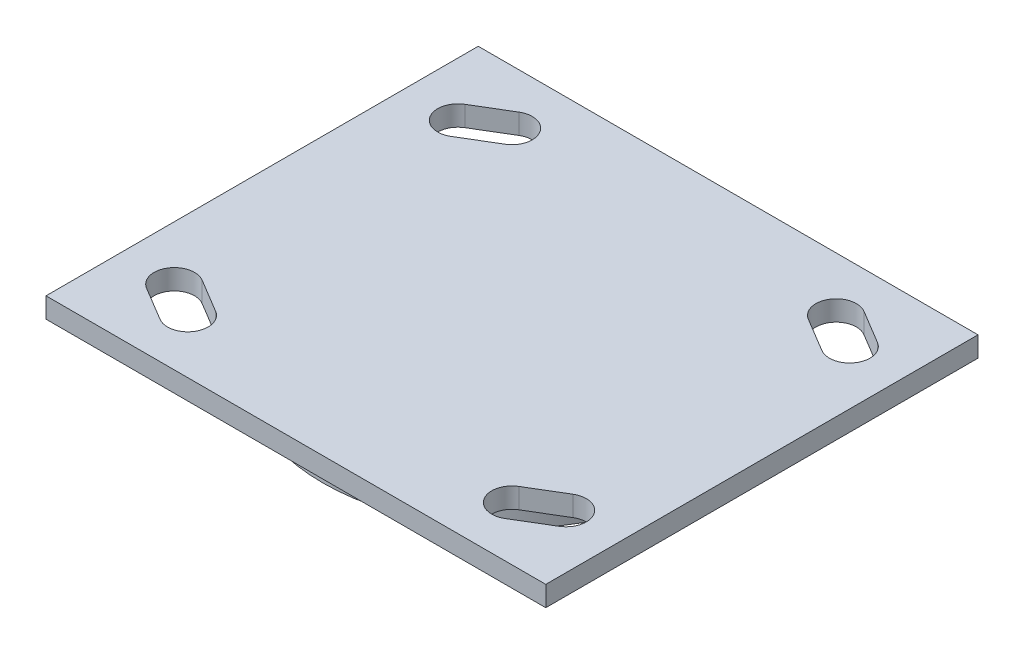
ISO-10303-21;
HEADER;
FILE_DESCRIPTION(('STEP AP214'),'2;1');
FILE_NAME('part.step','',(''),(''),'','','');
FILE_SCHEMA(('AUTOMOTIVE_DESIGN { 1 0 10303 214 1 1 1 1 }'));
ENDSEC;
DATA;
#1=APPLICATION_CONTEXT('core data for automotive mechanical design processes');
#2=APPLICATION_PROTOCOL_DEFINITION('international standard','automotive_design',2000,#1);
#3=PRODUCT_CONTEXT('',#1,'mechanical');
#4=PRODUCT('Part','Part','',(#3));
#5=PRODUCT_RELATED_PRODUCT_CATEGORY('part','',(#4));
#6=PRODUCT_DEFINITION_FORMATION('','',#4);
#7=PRODUCT_DEFINITION_CONTEXT('part definition',#1,'design');
#8=PRODUCT_DEFINITION('design','',#6,#7);
#9=PRODUCT_DEFINITION_SHAPE('','',#8);
#10=(LENGTH_UNIT() NAMED_UNIT(*) SI_UNIT(.MILLI.,.METRE.));
#11=(NAMED_UNIT(*) PLANE_ANGLE_UNIT() SI_UNIT($,.RADIAN.));
#12=(NAMED_UNIT(*) SI_UNIT($,.STERADIAN.) SOLID_ANGLE_UNIT());
#13=UNCERTAINTY_MEASURE_WITH_UNIT(LENGTH_MEASURE(1.E-05),#10,'distance_accuracy_value','');
#14=(GEOMETRIC_REPRESENTATION_CONTEXT(3) GLOBAL_UNCERTAINTY_ASSIGNED_CONTEXT((#13)) GLOBAL_UNIT_ASSIGNED_CONTEXT((#10,
#11,#12)) REPRESENTATION_CONTEXT('',''));
#15=CARTESIAN_POINT('',(0.,0.,0.));
#16=DIRECTION('',(0.,0.,1.));
#17=DIRECTION('',(1.,0.,0.));
#18=AXIS2_PLACEMENT_3D('',#15,#16,#17);
#19=CARTESIAN_POINT('',(40.64,-11.9126,0.));
#20=DIRECTION('',(0.,1.,0.));
#21=DIRECTION('',(-1.,0.,0.));
#22=AXIS2_PLACEMENT_3D('',#19,#20,#21);
#23=PLANE('',#22);
#24=CARTESIAN_POINT('',(0.,-11.9126,0.));
#25=DIRECTION('',(0.,1.,0.));
#26=DIRECTION('',(-1.,0.,0.));
#27=AXIS2_PLACEMENT_3D('',#24,#25,#26);
#28=CIRCLE('',#27,44.45);
#29=CARTESIAN_POINT('',(-44.45,-11.9126,0.));
#30=VERTEX_POINT('',#29);
#31=EDGE_CURVE('E12',#30,#30,#28,.T.);
#32=ORIENTED_EDGE('',*,*,#31,.F.);
#33=EDGE_LOOP('',(#32));
#34=FACE_BOUND('',#33,.T.);
#35=ADVANCED_FACE('F39',(#34),#23,.F.);
#36=CARTESIAN_POINT('',(0.,-4.76250000000001,0.));
#37=DIRECTION('',(0.,1.,0.));
#38=DIRECTION('',(-1.,0.,0.));
#39=AXIS2_PLACEMENT_3D('',#36,#37,#38);
#40=CYLINDRICAL_SURFACE('',#39,44.45);
#41=CARTESIAN_POINT('',(0.,-4.76250000000001,0.));
#42=DIRECTION('',(0.,1.,0.));
#43=DIRECTION('',(-1.,0.,0.));
#44=AXIS2_PLACEMENT_3D('',#41,#42,#43);
#45=CIRCLE('',#44,44.45);
#46=CARTESIAN_POINT('',(-44.45,-4.76250000000001,0.));
#47=VERTEX_POINT('',#46);
#48=EDGE_CURVE('E46',#47,#47,#45,.T.);
#49=ORIENTED_EDGE('',*,*,#48,.F.);
#50=EDGE_LOOP('',(#49));
#51=FACE_BOUND('',#50,.T.);
#52=ORIENTED_EDGE('',*,*,#31,.T.);
#53=EDGE_LOOP('',(#52));
#54=FACE_BOUND('',#53,.T.);
#55=ADVANCED_FACE('F339',(#51,#54),#40,.T.);
#56=CARTESIAN_POINT('',(-58.7375,-4.7625,50.8));
#57=DIRECTION('',(0.,1.,0.));
#58=DIRECTION('',(0.,0.,1.));
#59=AXIS2_PLACEMENT_3D('',#56,#57,#58);
#60=PLANE('',#59);
#61=DIRECTION('',(1.,0.,0.));
#62=VECTOR('',#61,1.);
#63=CARTESIAN_POINT('',(-58.7375,-4.7625,-50.8));
#64=LINE('',#63,#62);
#65=CARTESIAN_POINT('',(-58.7375,-4.7625,-50.8));
#66=VERTEX_POINT('',#65);
#67=CARTESIAN_POINT('',(58.7375,-4.7625,-50.8));
#68=VERTEX_POINT('',#67);
#69=EDGE_CURVE('E321',#66,#68,#64,.T.);
#70=ORIENTED_EDGE('',*,*,#69,.T.);
#71=DIRECTION('',(0.,0.,-1.));
#72=VECTOR('',#71,1.);
#73=CARTESIAN_POINT('',(58.7375,-4.7625,50.8));
#74=LINE('',#73,#72);
#75=CARTESIAN_POINT('',(58.7375,-4.7625,50.8));
#76=VERTEX_POINT('',#75);
#77=EDGE_CURVE('E331',#76,#68,#74,.T.);
#78=ORIENTED_EDGE('',*,*,#77,.F.);
#79=DIRECTION('',(1.,0.,0.));
#80=VECTOR('',#79,1.);
#81=CARTESIAN_POINT('',(-58.7375,-4.7625,50.8));
#82=LINE('',#81,#80);
#83=CARTESIAN_POINT('',(-58.7375,-4.7625,50.8));
#84=VERTEX_POINT('',#83);
#85=EDGE_CURVE('E311',#84,#76,#82,.T.);
#86=ORIENTED_EDGE('',*,*,#85,.F.);
#87=DIRECTION('',(0.,0.,-1.));
#88=VECTOR('',#87,1.);
#89=CARTESIAN_POINT('',(-58.7375,-4.7625,50.8));
#90=LINE('',#89,#88);
#91=EDGE_CURVE('E334',#84,#66,#90,.T.);
#92=ORIENTED_EDGE('',*,*,#91,.T.);
#93=EDGE_LOOP('',(#70,#78,#86,#92));
#94=FACE_BOUND('',#93,.T.);
#95=DIRECTION('',(0.857492925712546,0.,-0.514495755427524));
#96=VECTOR('',#95,1.);
#97=CARTESIAN_POINT('',(-35.6497139647764,-4.7625,-34.016189941294));
#98=LINE('',#97,#96);
#99=CARTESIAN_POINT('',(-43.5872139647764,-4.7625,-29.253689941294));
#100=VERTEX_POINT('',#99);
#101=CARTESIAN_POINT('',(-35.6497139647764,-4.7625,-34.016189941294));
#102=VERTEX_POINT('',#101);
#103=EDGE_CURVE('E286',#100,#102,#98,.T.);
#104=ORIENTED_EDGE('',*,*,#103,.T.);
#105=CARTESIAN_POINT('',(-38.1,-4.7625,-38.1));
#106=DIRECTION('',(0.,1.,0.));
#107=DIRECTION('',(0.,0.,1.));
#108=AXIS2_PLACEMENT_3D('',#105,#106,#107);
#109=CIRCLE('',#108,4.76250000000001);
#110=CARTESIAN_POINT('',(-40.5502860352236,-4.7625,-42.183810058706));
#111=VERTEX_POINT('',#110);
#112=EDGE_CURVE('E276',#102,#111,#109,.T.);
#113=ORIENTED_EDGE('',*,*,#112,.T.);
#114=DIRECTION('',(-0.857492925712543,0.,0.514495755427529));
#115=VECTOR('',#114,1.);
#116=CARTESIAN_POINT('',(-40.5502860352236,-4.7625,-42.183810058706));
#117=LINE('',#116,#115);
#118=CARTESIAN_POINT('',(-48.4877860352236,-4.7625,-37.421310058706));
#119=VERTEX_POINT('',#118);
#120=EDGE_CURVE('E279',#111,#119,#117,.T.);
#121=ORIENTED_EDGE('',*,*,#120,.T.);
#122=CARTESIAN_POINT('',(-46.0375,-4.7625,-33.3375));
#123=DIRECTION('',(0.,1.,0.));
#124=DIRECTION('',(0.,0.,1.));
#125=AXIS2_PLACEMENT_3D('',#122,#123,#124);
#126=CIRCLE('',#125,4.76249999999998);
#127=EDGE_CURVE('E283',#119,#100,#126,.T.);
#128=ORIENTED_EDGE('',*,*,#127,.T.);
#129=EDGE_LOOP('',(#104,#113,#121,#128));
#130=FACE_BOUND('',#129,.T.);
#131=DIRECTION('',(0.857492925712543,0.,0.514495755427529));
#132=VECTOR('',#131,1.);
#133=CARTESIAN_POINT('',(-40.5502860352236,-4.7625,42.183810058706));
#134=LINE('',#133,#132);
#135=CARTESIAN_POINT('',(-48.4877860352236,-4.7625,37.421310058706));
#136=VERTEX_POINT('',#135);
#137=CARTESIAN_POINT('',(-40.5502860352236,-4.7625,42.183810058706));
#138=VERTEX_POINT('',#137);
#139=EDGE_CURVE('E254',#136,#138,#134,.T.);
#140=ORIENTED_EDGE('',*,*,#139,.T.);
#141=CARTESIAN_POINT('',(-38.1,-4.7625,38.1));
#142=DIRECTION('',(0.,1.,0.));
#143=DIRECTION('',(0.,0.,-1.));
#144=AXIS2_PLACEMENT_3D('',#141,#142,#143);
#145=CIRCLE('',#144,4.76250000000001);
#146=CARTESIAN_POINT('',(-35.6497139647764,-4.7625,34.016189941294));
#147=VERTEX_POINT('',#146);
#148=EDGE_CURVE('E244',#138,#147,#145,.T.);
#149=ORIENTED_EDGE('',*,*,#148,.T.);
#150=DIRECTION('',(-0.857492925712546,0.,-0.514495755427524));
#151=VECTOR('',#150,1.);
#152=CARTESIAN_POINT('',(-35.6497139647764,-4.7625,34.016189941294));
#153=LINE('',#152,#151);
#154=CARTESIAN_POINT('',(-43.5872139647764,-4.7625,29.253689941294));
#155=VERTEX_POINT('',#154);
#156=EDGE_CURVE('E247',#147,#155,#153,.T.);
#157=ORIENTED_EDGE('',*,*,#156,.T.);
#158=CARTESIAN_POINT('',(-46.0375,-4.7625,33.3375));
#159=DIRECTION('',(0.,1.,0.));
#160=DIRECTION('',(0.,0.,-1.));
#161=AXIS2_PLACEMENT_3D('',#158,#159,#160);
#162=CIRCLE('',#161,4.76249999999998);
#163=EDGE_CURVE('E251',#155,#136,#162,.T.);
#164=ORIENTED_EDGE('',*,*,#163,.T.);
#165=EDGE_LOOP('',(#140,#149,#157,#164));
#166=FACE_BOUND('',#165,.T.);
#167=DIRECTION('',(-0.857492925712543,0.,-0.514495755427529));
#168=VECTOR('',#167,1.);
#169=CARTESIAN_POINT('',(40.5502860352236,-4.7625,-42.183810058706));
#170=LINE('',#169,#168);
#171=CARTESIAN_POINT('',(48.4877860352236,-4.7625,-37.421310058706));
#172=VERTEX_POINT('',#171);
#173=CARTESIAN_POINT('',(40.5502860352236,-4.7625,-42.183810058706));
#174=VERTEX_POINT('',#173);
#175=EDGE_CURVE('E222',#172,#174,#170,.T.);
#176=ORIENTED_EDGE('',*,*,#175,.T.);
#177=CARTESIAN_POINT('',(38.1,-4.7625,-38.1));
#178=DIRECTION('',(0.,1.,0.));
#179=DIRECTION('',(0.,0.,-1.));
#180=AXIS2_PLACEMENT_3D('',#177,#178,#179);
#181=CIRCLE('',#180,4.76250000000001);
#182=CARTESIAN_POINT('',(35.6497139647764,-4.7625,-34.016189941294));
#183=VERTEX_POINT('',#182);
#184=EDGE_CURVE('E212',#174,#183,#181,.T.);
#185=ORIENTED_EDGE('',*,*,#184,.T.);
#186=DIRECTION('',(0.857492925712546,0.,0.514495755427524));
#187=VECTOR('',#186,1.);
#188=CARTESIAN_POINT('',(35.6497139647764,-4.7625,-34.016189941294));
#189=LINE('',#188,#187);
#190=CARTESIAN_POINT('',(43.5872139647764,-4.7625,-29.253689941294));
#191=VERTEX_POINT('',#190);
#192=EDGE_CURVE('E215',#183,#191,#189,.T.);
#193=ORIENTED_EDGE('',*,*,#192,.T.);
#194=CARTESIAN_POINT('',(46.0375,-4.7625,-33.3375));
#195=DIRECTION('',(0.,1.,0.));
#196=DIRECTION('',(0.,0.,-1.));
#197=AXIS2_PLACEMENT_3D('',#194,#195,#196);
#198=CIRCLE('',#197,4.76249999999998);
#199=EDGE_CURVE('E219',#191,#172,#198,.T.);
#200=ORIENTED_EDGE('',*,*,#199,.T.);
#201=EDGE_LOOP('',(#176,#185,#193,#200));
#202=FACE_BOUND('',#201,.T.);
#203=DIRECTION('',(-0.857492925712546,0.,0.514495755427524));
#204=VECTOR('',#203,1.);
#205=CARTESIAN_POINT('',(35.6497139647764,-4.7625,34.016189941294));
#206=LINE('',#205,#204);
#207=CARTESIAN_POINT('',(43.5872139647764,-4.7625,29.253689941294));
#208=VERTEX_POINT('',#207);
#209=CARTESIAN_POINT('',(35.6497139647764,-4.7625,34.016189941294));
#210=VERTEX_POINT('',#209);
#211=EDGE_CURVE('E183',#208,#210,#206,.T.);
#212=ORIENTED_EDGE('',*,*,#211,.T.);
#213=CARTESIAN_POINT('',(38.1,-4.7625,38.1));
#214=DIRECTION('',(0.,1.,0.));
#215=DIRECTION('',(0.,0.,1.));
#216=AXIS2_PLACEMENT_3D('',#213,#214,#215);
#217=CIRCLE('',#216,4.76250000000001);
#218=CARTESIAN_POINT('',(40.5502860352236,-4.7625,42.183810058706));
#219=VERTEX_POINT('',#218);
#220=EDGE_CURVE('E177',#210,#219,#217,.T.);
#221=ORIENTED_EDGE('',*,*,#220,.T.);
#222=DIRECTION('',(0.857492925712543,0.,-0.514495755427529));
#223=VECTOR('',#222,1.);
#224=CARTESIAN_POINT('',(40.5502860352236,-4.7625,42.183810058706));
#225=LINE('',#224,#223);
#226=CARTESIAN_POINT('',(48.4877860352236,-4.7625,37.421310058706));
#227=VERTEX_POINT('',#226);
#228=EDGE_CURVE('E186',#219,#227,#225,.T.);
#229=ORIENTED_EDGE('',*,*,#228,.T.);
#230=CARTESIAN_POINT('',(46.0375,-4.7625,33.3375));
#231=DIRECTION('',(0.,1.,0.));
#232=DIRECTION('',(0.,0.,1.));
#233=AXIS2_PLACEMENT_3D('',#230,#231,#232);
#234=CIRCLE('',#233,4.76249999999998);
#235=EDGE_CURVE('E53',#227,#208,#234,.T.);
#236=ORIENTED_EDGE('',*,*,#235,.T.);
#237=EDGE_LOOP('',(#212,#221,#229,#236));
#238=FACE_BOUND('',#237,.T.);
#239=ORIENTED_EDGE('',*,*,#48,.T.);
#240=EDGE_LOOP('',(#239));
#241=FACE_BOUND('',#240,.T.);
#242=ADVANCED_FACE('F190',(#94,#130,#166,#202,#238,#241),#60,.F.);
#243=CARTESIAN_POINT('',(-58.7375,0.,50.8));
#244=DIRECTION('',(1.,0.,0.));
#245=DIRECTION('',(0.,0.,-1.));
#246=AXIS2_PLACEMENT_3D('',#243,#244,#245);
#247=PLANE('',#246);
#248=DIRECTION('',(0.,-1.,0.));
#249=VECTOR('',#248,1.);
#250=CARTESIAN_POINT('',(-58.7375,0.,-50.8));
#251=LINE('',#250,#249);
#252=CARTESIAN_POINT('',(-58.7375,0.,-50.8));
#253=VERTEX_POINT('',#252);
#254=EDGE_CURVE('E301',#253,#66,#251,.T.);
#255=ORIENTED_EDGE('',*,*,#254,.T.);
#256=ORIENTED_EDGE('',*,*,#91,.F.);
#257=DIRECTION('',(0.,-1.,0.));
#258=VECTOR('',#257,1.);
#259=CARTESIAN_POINT('',(-58.7375,0.,50.8));
#260=LINE('',#259,#258);
#261=CARTESIAN_POINT('',(-58.7375,0.,50.8));
#262=VERTEX_POINT('',#261);
#263=EDGE_CURVE('E308',#262,#84,#260,.T.);
#264=ORIENTED_EDGE('',*,*,#263,.F.);
#265=DIRECTION('',(0.,0.,-1.));
#266=VECTOR('',#265,1.);
#267=CARTESIAN_POINT('',(-58.7375,0.,50.8));
#268=LINE('',#267,#266);
#269=EDGE_CURVE('E318',#262,#253,#268,.T.);
#270=ORIENTED_EDGE('',*,*,#269,.T.);
#271=EDGE_LOOP('',(#255,#256,#264,#270));
#272=FACE_BOUND('',#271,.T.);
#273=ADVANCED_FACE('F358',(#272),#247,.F.);
#274=CARTESIAN_POINT('',(58.7375,0.,50.8));
#275=DIRECTION('',(-1.,0.,0.));
#276=DIRECTION('',(0.,0.,1.));
#277=AXIS2_PLACEMENT_3D('',#274,#275,#276);
#278=PLANE('',#277);
#279=DIRECTION('',(0.,1.,0.));
#280=VECTOR('',#279,1.);
#281=CARTESIAN_POINT('',(58.7375,0.,-50.8));
#282=LINE('',#281,#280);
#283=CARTESIAN_POINT('',(58.7375,0.,-50.8));
#284=VERTEX_POINT('',#283);
#285=EDGE_CURVE('E323',#68,#284,#282,.T.);
#286=ORIENTED_EDGE('',*,*,#285,.T.);
#287=DIRECTION('',(0.,0.,-1.));
#288=VECTOR('',#287,1.);
#289=CARTESIAN_POINT('',(58.7375,0.,50.8));
#290=LINE('',#289,#288);
#291=CARTESIAN_POINT('',(58.7375,0.,50.8));
#292=VERTEX_POINT('',#291);
#293=EDGE_CURVE('E328',#292,#284,#290,.T.);
#294=ORIENTED_EDGE('',*,*,#293,.F.);
#295=DIRECTION('',(0.,1.,0.));
#296=VECTOR('',#295,1.);
#297=CARTESIAN_POINT('',(58.7375,0.,50.8));
#298=LINE('',#297,#296);
#299=EDGE_CURVE('E314',#76,#292,#298,.T.);
#300=ORIENTED_EDGE('',*,*,#299,.F.);
#301=ORIENTED_EDGE('',*,*,#77,.T.);
#302=EDGE_LOOP('',(#286,#294,#300,#301));
#303=FACE_BOUND('',#302,.T.);
#304=ADVANCED_FACE('F365',(#303),#278,.F.);
#305=CARTESIAN_POINT('',(-58.7375,0.,50.8));
#306=DIRECTION('',(0.,-1.,0.));
#307=DIRECTION('',(0.,0.,-1.));
#308=AXIS2_PLACEMENT_3D('',#305,#306,#307);
#309=PLANE('',#308);
#310=DIRECTION('',(0.857492925712543,0.,-0.514495755427529));
#311=VECTOR('',#310,1.);
#312=CARTESIAN_POINT('',(40.5502860352236,0.,42.183810058706));
#313=LINE('',#312,#311);
#314=CARTESIAN_POINT('',(40.5502860352236,0.,42.183810058706));
#315=VERTEX_POINT('',#314);
#316=CARTESIAN_POINT('',(48.4877860352236,0.,37.421310058706));
#317=VERTEX_POINT('',#316);
#318=EDGE_CURVE('E202',#315,#317,#313,.T.);
#319=ORIENTED_EDGE('',*,*,#318,.F.);
#320=CARTESIAN_POINT('',(38.1,0.,38.1));
#321=DIRECTION('',(0.,1.,0.));
#322=DIRECTION('',(0.,0.,1.));
#323=AXIS2_PLACEMENT_3D('',#320,#321,#322);
#324=CIRCLE('',#323,4.76250000000001);
#325=CARTESIAN_POINT('',(35.6497139647764,0.,34.016189941294));
#326=VERTEX_POINT('',#325);
#327=EDGE_CURVE('E61',#326,#315,#324,.T.);
#328=ORIENTED_EDGE('',*,*,#327,.F.);
#329=DIRECTION('',(-0.857492925712546,0.,0.514495755427524));
#330=VECTOR('',#329,1.);
#331=CARTESIAN_POINT('',(35.6497139647764,0.,34.016189941294));
#332=LINE('',#331,#330);
#333=CARTESIAN_POINT('',(43.5872139647764,0.,29.253689941294));
#334=VERTEX_POINT('',#333);
#335=EDGE_CURVE('E193',#334,#326,#332,.T.);
#336=ORIENTED_EDGE('',*,*,#335,.F.);
#337=CARTESIAN_POINT('',(46.0375,0.,33.3375));
#338=DIRECTION('',(0.,1.,0.));
#339=DIRECTION('',(0.,0.,1.));
#340=AXIS2_PLACEMENT_3D('',#337,#338,#339);
#341=CIRCLE('',#340,4.76249999999998);
#342=EDGE_CURVE('E196',#317,#334,#341,.T.);
#343=ORIENTED_EDGE('',*,*,#342,.F.);
#344=EDGE_LOOP('',(#319,#328,#336,#343));
#345=FACE_BOUND('',#344,.T.);
#346=DIRECTION('',(0.857492925712546,0.,0.514495755427524));
#347=VECTOR('',#346,1.);
#348=CARTESIAN_POINT('',(35.6497139647764,0.,-34.016189941294));
#349=LINE('',#348,#347);
#350=CARTESIAN_POINT('',(35.6497139647764,0.,-34.016189941294));
#351=VERTEX_POINT('',#350);
#352=CARTESIAN_POINT('',(43.5872139647764,0.,-29.253689941294));
#353=VERTEX_POINT('',#352);
#354=EDGE_CURVE('E227',#351,#353,#349,.T.);
#355=ORIENTED_EDGE('',*,*,#354,.F.);
#356=CARTESIAN_POINT('',(38.1,0.,-38.1));
#357=DIRECTION('',(0.,1.,0.));
#358=DIRECTION('',(0.,0.,-1.));
#359=AXIS2_PLACEMENT_3D('',#356,#357,#358);
#360=CIRCLE('',#359,4.76250000000001);
#361=CARTESIAN_POINT('',(40.5502860352236,0.,-42.183810058706));
#362=VERTEX_POINT('',#361);
#363=EDGE_CURVE('E208',#362,#351,#360,.T.);
#364=ORIENTED_EDGE('',*,*,#363,.F.);
#365=DIRECTION('',(-0.857492925712543,0.,-0.514495755427529));
#366=VECTOR('',#365,1.);
#367=CARTESIAN_POINT('',(40.5502860352236,0.,-42.183810058706));
#368=LINE('',#367,#366);
#369=CARTESIAN_POINT('',(48.4877860352236,0.,-37.421310058706));
#370=VERTEX_POINT('',#369);
#371=EDGE_CURVE('E216',#370,#362,#368,.T.);
#372=ORIENTED_EDGE('',*,*,#371,.F.);
#373=CARTESIAN_POINT('',(46.0375,0.,-33.3375));
#374=DIRECTION('',(0.,1.,0.));
#375=DIRECTION('',(0.,0.,-1.));
#376=AXIS2_PLACEMENT_3D('',#373,#374,#375);
#377=CIRCLE('',#376,4.76249999999998);
#378=EDGE_CURVE('E230',#353,#370,#377,.T.);
#379=ORIENTED_EDGE('',*,*,#378,.F.);
#380=EDGE_LOOP('',(#355,#364,#372,#379));
#381=FACE_BOUND('',#380,.T.);
#382=DIRECTION('',(-0.857492925712546,0.,-0.514495755427524));
#383=VECTOR('',#382,1.);
#384=CARTESIAN_POINT('',(-35.6497139647764,0.,34.016189941294));
#385=LINE('',#384,#383);
#386=CARTESIAN_POINT('',(-35.6497139647764,0.,34.016189941294));
#387=VERTEX_POINT('',#386);
#388=CARTESIAN_POINT('',(-43.5872139647764,0.,29.253689941294));
#389=VERTEX_POINT('',#388);
#390=EDGE_CURVE('E259',#387,#389,#385,.T.);
#391=ORIENTED_EDGE('',*,*,#390,.F.);
#392=CARTESIAN_POINT('',(-38.1,0.,38.1));
#393=DIRECTION('',(0.,1.,0.));
#394=DIRECTION('',(0.,0.,-1.));
#395=AXIS2_PLACEMENT_3D('',#392,#393,#394);
#396=CIRCLE('',#395,4.76250000000001);
#397=CARTESIAN_POINT('',(-40.5502860352236,0.,42.183810058706));
#398=VERTEX_POINT('',#397);
#399=EDGE_CURVE('E237',#398,#387,#396,.T.);
#400=ORIENTED_EDGE('',*,*,#399,.F.);
#401=DIRECTION('',(0.857492925712543,0.,0.514495755427529));
#402=VECTOR('',#401,1.);
#403=CARTESIAN_POINT('',(-40.5502860352236,0.,42.183810058706));
#404=LINE('',#403,#402);
#405=CARTESIAN_POINT('',(-48.4877860352236,0.,37.421310058706));
#406=VERTEX_POINT('',#405);
#407=EDGE_CURVE('E248',#406,#398,#404,.T.);
#408=ORIENTED_EDGE('',*,*,#407,.F.);
#409=CARTESIAN_POINT('',(-46.0375,0.,33.3375));
#410=DIRECTION('',(0.,1.,0.));
#411=DIRECTION('',(0.,0.,-1.));
#412=AXIS2_PLACEMENT_3D('',#409,#410,#411);
#413=CIRCLE('',#412,4.76249999999998);
#414=EDGE_CURVE('E262',#389,#406,#413,.T.);
#415=ORIENTED_EDGE('',*,*,#414,.F.);
#416=EDGE_LOOP('',(#391,#400,#408,#415));
#417=FACE_BOUND('',#416,.T.);
#418=DIRECTION('',(-0.857492925712543,0.,0.514495755427529));
#419=VECTOR('',#418,1.);
#420=CARTESIAN_POINT('',(-40.5502860352236,0.,-42.183810058706));
#421=LINE('',#420,#419);
#422=CARTESIAN_POINT('',(-40.5502860352236,0.,-42.183810058706));
#423=VERTEX_POINT('',#422);
#424=CARTESIAN_POINT('',(-48.4877860352236,0.,-37.421310058706));
#425=VERTEX_POINT('',#424);
#426=EDGE_CURVE('E291',#423,#425,#421,.T.);
#427=ORIENTED_EDGE('',*,*,#426,.F.);
#428=CARTESIAN_POINT('',(-38.1,0.,-38.1));
#429=DIRECTION('',(0.,1.,0.));
#430=DIRECTION('',(0.,0.,1.));
#431=AXIS2_PLACEMENT_3D('',#428,#429,#430);
#432=CIRCLE('',#431,4.76250000000001);
#433=CARTESIAN_POINT('',(-35.6497139647764,0.,-34.016189941294));
#434=VERTEX_POINT('',#433);
#435=EDGE_CURVE('E269',#434,#423,#432,.T.);
#436=ORIENTED_EDGE('',*,*,#435,.F.);
#437=DIRECTION('',(0.857492925712546,0.,-0.514495755427524));
#438=VECTOR('',#437,1.);
#439=CARTESIAN_POINT('',(-35.6497139647764,0.,-34.016189941294));
#440=LINE('',#439,#438);
#441=CARTESIAN_POINT('',(-43.5872139647764,0.,-29.253689941294));
#442=VERTEX_POINT('',#441);
#443=EDGE_CURVE('E280',#442,#434,#440,.T.);
#444=ORIENTED_EDGE('',*,*,#443,.F.);
#445=CARTESIAN_POINT('',(-46.0375,0.,-33.3375));
#446=DIRECTION('',(0.,1.,0.));
#447=DIRECTION('',(0.,0.,1.));
#448=AXIS2_PLACEMENT_3D('',#445,#446,#447);
#449=CIRCLE('',#448,4.76249999999998);
#450=EDGE_CURVE('E294',#425,#442,#449,.T.);
#451=ORIENTED_EDGE('',*,*,#450,.F.);
#452=EDGE_LOOP('',(#427,#436,#444,#451));
#453=FACE_BOUND('',#452,.T.);
#454=DIRECTION('',(-1.,0.,0.));
#455=VECTOR('',#454,1.);
#456=CARTESIAN_POINT('',(-58.7375,0.,-50.8));
#457=LINE('',#456,#455);
#458=EDGE_CURVE('E312',#284,#253,#457,.T.);
#459=ORIENTED_EDGE('',*,*,#458,.T.);
#460=ORIENTED_EDGE('',*,*,#269,.F.);
#461=DIRECTION('',(-1.,0.,0.));
#462=VECTOR('',#461,1.);
#463=CARTESIAN_POINT('',(-58.7375,0.,50.8));
#464=LINE('',#463,#462);
#465=EDGE_CURVE('E316',#292,#262,#464,.T.);
#466=ORIENTED_EDGE('',*,*,#465,.F.);
#467=ORIENTED_EDGE('',*,*,#293,.T.);
#468=EDGE_LOOP('',(#459,#460,#466,#467));
#469=FACE_BOUND('',#468,.T.);
#470=ADVANCED_FACE('F372',(#345,#381,#417,#453,#469),#309,.F.);
#471=CARTESIAN_POINT('',(-58.7375,-4.7625,50.8));
#472=DIRECTION('',(0.,0.,1.));
#473=DIRECTION('',(1.,0.,0.));
#474=AXIS2_PLACEMENT_3D('',#471,#472,#473);
#475=PLANE('',#474);
#476=ORIENTED_EDGE('',*,*,#263,.T.);
#477=ORIENTED_EDGE('',*,*,#85,.T.);
#478=ORIENTED_EDGE('',*,*,#299,.T.);
#479=ORIENTED_EDGE('',*,*,#465,.T.);
#480=EDGE_LOOP('',(#476,#477,#478,#479));
#481=FACE_BOUND('',#480,.T.);
#482=ADVANCED_FACE('F379',(#481),#475,.T.);
#483=CARTESIAN_POINT('',(-58.7375,-4.7625,-50.8));
#484=DIRECTION('',(0.,0.,1.));
#485=DIRECTION('',(1.,0.,0.));
#486=AXIS2_PLACEMENT_3D('',#483,#484,#485);
#487=PLANE('',#486);
#488=ORIENTED_EDGE('',*,*,#254,.F.);
#489=ORIENTED_EDGE('',*,*,#458,.F.);
#490=ORIENTED_EDGE('',*,*,#285,.F.);
#491=ORIENTED_EDGE('',*,*,#69,.F.);
#492=EDGE_LOOP('',(#488,#489,#490,#491));
#493=FACE_BOUND('',#492,.T.);
#494=ADVANCED_FACE('F386',(#493),#487,.F.);
#495=CARTESIAN_POINT('',(-38.1,-4.7625,-38.1));
#496=DIRECTION('',(0.,1.,0.));
#497=DIRECTION('',(0.,0.,1.));
#498=AXIS2_PLACEMENT_3D('',#495,#496,#497);
#499=CYLINDRICAL_SURFACE('',#498,4.76250000000001);
#500=ORIENTED_EDGE('',*,*,#435,.T.);
#501=DIRECTION('',(0.,1.,0.));
#502=VECTOR('',#501,1.);
#503=CARTESIAN_POINT('',(-40.5502860352236,-4.7625,-42.183810058706));
#504=LINE('',#503,#502);
#505=EDGE_CURVE('E289',#111,#423,#504,.T.);
#506=ORIENTED_EDGE('',*,*,#505,.F.);
#507=ORIENTED_EDGE('',*,*,#112,.F.);
#508=DIRECTION('',(0.,1.,0.));
#509=VECTOR('',#508,1.);
#510=CARTESIAN_POINT('',(-35.6497139647764,-4.7625,-34.016189941294));
#511=LINE('',#510,#509);
#512=EDGE_CURVE('E299',#102,#434,#511,.T.);
#513=ORIENTED_EDGE('',*,*,#512,.T.);
#514=EDGE_LOOP('',(#500,#506,#507,#513));
#515=FACE_BOUND('',#514,.T.);
#516=ADVANCED_FACE('F393',(#515),#499,.F.);
#517=CARTESIAN_POINT('',(-35.6497139647764,-4.7625,-34.016189941294));
#518=DIRECTION('',(0.514495755427524,0.,0.857492925712546));
#519=DIRECTION('',(0.857492925712546,0.,-0.514495755427524));
#520=AXIS2_PLACEMENT_3D('',#517,#518,#519);
#521=PLANE('',#520);
#522=ORIENTED_EDGE('',*,*,#443,.T.);
#523=ORIENTED_EDGE('',*,*,#512,.F.);
#524=ORIENTED_EDGE('',*,*,#103,.F.);
#525=DIRECTION('',(0.,1.,0.));
#526=VECTOR('',#525,1.);
#527=CARTESIAN_POINT('',(-43.5872139647764,-4.7625,-29.253689941294));
#528=LINE('',#527,#526);
#529=EDGE_CURVE('E302',#100,#442,#528,.T.);
#530=ORIENTED_EDGE('',*,*,#529,.T.);
#531=EDGE_LOOP('',(#522,#523,#524,#530));
#532=FACE_BOUND('',#531,.T.);
#533=ADVANCED_FACE('F400',(#532),#521,.F.);
#534=CARTESIAN_POINT('',(-46.0375,-4.7625,-33.3375));
#535=DIRECTION('',(0.,1.,0.));
#536=DIRECTION('',(0.,0.,1.));
#537=AXIS2_PLACEMENT_3D('',#534,#535,#536);
#538=CYLINDRICAL_SURFACE('',#537,4.76249999999998);
#539=ORIENTED_EDGE('',*,*,#450,.T.);
#540=ORIENTED_EDGE('',*,*,#529,.F.);
#541=ORIENTED_EDGE('',*,*,#127,.F.);
#542=DIRECTION('',(0.,1.,0.));
#543=VECTOR('',#542,1.);
#544=CARTESIAN_POINT('',(-48.4877860352236,-4.7625,-37.421310058706));
#545=LINE('',#544,#543);
#546=EDGE_CURVE('E304',#119,#425,#545,.T.);
#547=ORIENTED_EDGE('',*,*,#546,.T.);
#548=EDGE_LOOP('',(#539,#540,#541,#547));
#549=FACE_BOUND('',#548,.T.);
#550=ADVANCED_FACE('F407',(#549),#538,.F.);
#551=CARTESIAN_POINT('',(-40.5502860352236,-4.7625,-42.183810058706));
#552=DIRECTION('',(-0.514495755427529,0.,-0.857492925712543));
#553=DIRECTION('',(-0.857492925712543,0.,0.514495755427529));
#554=AXIS2_PLACEMENT_3D('',#551,#552,#553);
#555=PLANE('',#554);
#556=ORIENTED_EDGE('',*,*,#426,.T.);
#557=ORIENTED_EDGE('',*,*,#546,.F.);
#558=ORIENTED_EDGE('',*,*,#120,.F.);
#559=ORIENTED_EDGE('',*,*,#505,.T.);
#560=EDGE_LOOP('',(#556,#557,#558,#559));
#561=FACE_BOUND('',#560,.T.);
#562=ADVANCED_FACE('F414',(#561),#555,.F.);
#563=CARTESIAN_POINT('',(-38.1,-4.7625,38.1));
#564=DIRECTION('',(0.,1.,0.));
#565=DIRECTION('',(0.,0.,1.));
#566=AXIS2_PLACEMENT_3D('',#563,#564,#565);
#567=CYLINDRICAL_SURFACE('',#566,4.76250000000001);
#568=ORIENTED_EDGE('',*,*,#399,.T.);
#569=DIRECTION('',(0.,1.,0.));
#570=VECTOR('',#569,1.);
#571=CARTESIAN_POINT('',(-35.6497139647764,-4.7625,34.016189941294));
#572=LINE('',#571,#570);
#573=EDGE_CURVE('E257',#147,#387,#572,.T.);
#574=ORIENTED_EDGE('',*,*,#573,.F.);
#575=ORIENTED_EDGE('',*,*,#148,.F.);
#576=DIRECTION('',(0.,1.,0.));
#577=VECTOR('',#576,1.);
#578=CARTESIAN_POINT('',(-40.5502860352236,-4.7625,42.183810058706));
#579=LINE('',#578,#577);
#580=EDGE_CURVE('E267',#138,#398,#579,.T.);
#581=ORIENTED_EDGE('',*,*,#580,.T.);
#582=EDGE_LOOP('',(#568,#574,#575,#581));
#583=FACE_BOUND('',#582,.T.);
#584=ADVANCED_FACE('F421',(#583),#567,.F.);
#585=CARTESIAN_POINT('',(-40.5502860352236,-4.7625,42.183810058706));
#586=DIRECTION('',(-0.514495755427529,0.,0.857492925712543));
#587=DIRECTION('',(0.857492925712543,0.,0.514495755427529));
#588=AXIS2_PLACEMENT_3D('',#585,#586,#587);
#589=PLANE('',#588);
#590=ORIENTED_EDGE('',*,*,#407,.T.);
#591=ORIENTED_EDGE('',*,*,#580,.F.);
#592=ORIENTED_EDGE('',*,*,#139,.F.);
#593=DIRECTION('',(0.,1.,0.));
#594=VECTOR('',#593,1.);
#595=CARTESIAN_POINT('',(-48.4877860352236,-4.7625,37.421310058706));
#596=LINE('',#595,#594);
#597=EDGE_CURVE('E270',#136,#406,#596,.T.);
#598=ORIENTED_EDGE('',*,*,#597,.T.);
#599=EDGE_LOOP('',(#590,#591,#592,#598));
#600=FACE_BOUND('',#599,.T.);
#601=ADVANCED_FACE('F428',(#600),#589,.F.);
#602=CARTESIAN_POINT('',(-46.0375,-4.7625,33.3375));
#603=DIRECTION('',(0.,1.,0.));
#604=DIRECTION('',(0.,0.,1.));
#605=AXIS2_PLACEMENT_3D('',#602,#603,#604);
#606=CYLINDRICAL_SURFACE('',#605,4.76249999999998);
#607=ORIENTED_EDGE('',*,*,#414,.T.);
#608=ORIENTED_EDGE('',*,*,#597,.F.);
#609=ORIENTED_EDGE('',*,*,#163,.F.);
#610=DIRECTION('',(0.,1.,0.));
#611=VECTOR('',#610,1.);
#612=CARTESIAN_POINT('',(-43.5872139647764,-4.7625,29.253689941294));
#613=LINE('',#612,#611);
#614=EDGE_CURVE('E272',#155,#389,#613,.T.);
#615=ORIENTED_EDGE('',*,*,#614,.T.);
#616=EDGE_LOOP('',(#607,#608,#609,#615));
#617=FACE_BOUND('',#616,.T.);
#618=ADVANCED_FACE('F435',(#617),#606,.F.);
#619=CARTESIAN_POINT('',(-35.6497139647764,-4.7625,34.016189941294));
#620=DIRECTION('',(0.514495755427524,0.,-0.857492925712546));
#621=DIRECTION('',(-0.857492925712546,0.,-0.514495755427524));
#622=AXIS2_PLACEMENT_3D('',#619,#620,#621);
#623=PLANE('',#622);
#624=ORIENTED_EDGE('',*,*,#390,.T.);
#625=ORIENTED_EDGE('',*,*,#614,.F.);
#626=ORIENTED_EDGE('',*,*,#156,.F.);
#627=ORIENTED_EDGE('',*,*,#573,.T.);
#628=EDGE_LOOP('',(#624,#625,#626,#627));
#629=FACE_BOUND('',#628,.T.);
#630=ADVANCED_FACE('F442',(#629),#623,.F.);
#631=CARTESIAN_POINT('',(38.1,-4.7625,-38.1));
#632=DIRECTION('',(0.,1.,0.));
#633=DIRECTION('',(0.,0.,1.));
#634=AXIS2_PLACEMENT_3D('',#631,#632,#633);
#635=CYLINDRICAL_SURFACE('',#634,4.76250000000001);
#636=ORIENTED_EDGE('',*,*,#363,.T.);
#637=DIRECTION('',(0.,1.,0.));
#638=VECTOR('',#637,1.);
#639=CARTESIAN_POINT('',(35.6497139647764,-4.7625,-34.016189941294));
#640=LINE('',#639,#638);
#641=EDGE_CURVE('E225',#183,#351,#640,.T.);
#642=ORIENTED_EDGE('',*,*,#641,.F.);
#643=ORIENTED_EDGE('',*,*,#184,.F.);
#644=DIRECTION('',(0.,1.,0.));
#645=VECTOR('',#644,1.);
#646=CARTESIAN_POINT('',(40.5502860352236,-4.7625,-42.183810058706));
#647=LINE('',#646,#645);
#648=EDGE_CURVE('E235',#174,#362,#647,.T.);
#649=ORIENTED_EDGE('',*,*,#648,.T.);
#650=EDGE_LOOP('',(#636,#642,#643,#649));
#651=FACE_BOUND('',#650,.T.);
#652=ADVANCED_FACE('F449',(#651),#635,.F.);
#653=CARTESIAN_POINT('',(40.5502860352236,-4.7625,-42.183810058706));
#654=DIRECTION('',(0.514495755427529,0.,-0.857492925712543));
#655=DIRECTION('',(-0.857492925712543,0.,-0.514495755427529));
#656=AXIS2_PLACEMENT_3D('',#653,#654,#655);
#657=PLANE('',#656);
#658=ORIENTED_EDGE('',*,*,#371,.T.);
#659=ORIENTED_EDGE('',*,*,#648,.F.);
#660=ORIENTED_EDGE('',*,*,#175,.F.);
#661=DIRECTION('',(0.,1.,0.));
#662=VECTOR('',#661,1.);
#663=CARTESIAN_POINT('',(48.4877860352236,-4.7625,-37.421310058706));
#664=LINE('',#663,#662);
#665=EDGE_CURVE('E238',#172,#370,#664,.T.);
#666=ORIENTED_EDGE('',*,*,#665,.T.);
#667=EDGE_LOOP('',(#658,#659,#660,#666));
#668=FACE_BOUND('',#667,.T.);
#669=ADVANCED_FACE('F456',(#668),#657,.F.);
#670=CARTESIAN_POINT('',(46.0375,-4.7625,-33.3375));
#671=DIRECTION('',(0.,1.,0.));
#672=DIRECTION('',(0.,0.,1.));
#673=AXIS2_PLACEMENT_3D('',#670,#671,#672);
#674=CYLINDRICAL_SURFACE('',#673,4.76249999999998);
#675=ORIENTED_EDGE('',*,*,#378,.T.);
#676=ORIENTED_EDGE('',*,*,#665,.F.);
#677=ORIENTED_EDGE('',*,*,#199,.F.);
#678=DIRECTION('',(0.,1.,0.));
#679=VECTOR('',#678,1.);
#680=CARTESIAN_POINT('',(43.5872139647764,-4.7625,-29.253689941294));
#681=LINE('',#680,#679);
#682=EDGE_CURVE('E240',#191,#353,#681,.T.);
#683=ORIENTED_EDGE('',*,*,#682,.T.);
#684=EDGE_LOOP('',(#675,#676,#677,#683));
#685=FACE_BOUND('',#684,.T.);
#686=ADVANCED_FACE('F463',(#685),#674,.F.);
#687=CARTESIAN_POINT('',(35.6497139647764,-4.7625,-34.016189941294));
#688=DIRECTION('',(-0.514495755427524,0.,0.857492925712546));
#689=DIRECTION('',(0.857492925712546,0.,0.514495755427524));
#690=AXIS2_PLACEMENT_3D('',#687,#688,#689);
#691=PLANE('',#690);
#692=ORIENTED_EDGE('',*,*,#354,.T.);
#693=ORIENTED_EDGE('',*,*,#682,.F.);
#694=ORIENTED_EDGE('',*,*,#192,.F.);
#695=ORIENTED_EDGE('',*,*,#641,.T.);
#696=EDGE_LOOP('',(#692,#693,#694,#695));
#697=FACE_BOUND('',#696,.T.);
#698=ADVANCED_FACE('F470',(#697),#691,.F.);
#699=CARTESIAN_POINT('',(38.1,-4.7625,38.1));
#700=DIRECTION('',(0.,1.,0.));
#701=DIRECTION('',(0.,0.,1.));
#702=AXIS2_PLACEMENT_3D('',#699,#700,#701);
#703=CYLINDRICAL_SURFACE('',#702,4.76250000000001);
#704=ORIENTED_EDGE('',*,*,#327,.T.);
#705=DIRECTION('',(0.,1.,0.));
#706=VECTOR('',#705,1.);
#707=CARTESIAN_POINT('',(40.5502860352236,-4.7625,42.183810058706));
#708=LINE('',#707,#706);
#709=EDGE_CURVE('E173',#219,#315,#708,.T.);
#710=ORIENTED_EDGE('',*,*,#709,.F.);
#711=ORIENTED_EDGE('',*,*,#220,.F.);
#712=DIRECTION('',(0.,1.,0.));
#713=VECTOR('',#712,1.);
#714=CARTESIAN_POINT('',(35.6497139647764,-4.7625,34.016189941294));
#715=LINE('',#714,#713);
#716=EDGE_CURVE('E206',#210,#326,#715,.T.);
#717=ORIENTED_EDGE('',*,*,#716,.T.);
#718=EDGE_LOOP('',(#704,#710,#711,#717));
#719=FACE_BOUND('',#718,.T.);
#720=ADVANCED_FACE('F175',(#719),#703,.F.);
#721=CARTESIAN_POINT('',(35.6497139647764,-4.7625,34.016189941294));
#722=DIRECTION('',(-0.514495755427524,0.,-0.857492925712546));
#723=DIRECTION('',(-0.857492925712546,0.,0.514495755427524));
#724=AXIS2_PLACEMENT_3D('',#721,#722,#723);
#725=PLANE('',#724);
#726=ORIENTED_EDGE('',*,*,#335,.T.);
#727=ORIENTED_EDGE('',*,*,#716,.F.);
#728=ORIENTED_EDGE('',*,*,#211,.F.);
#729=DIRECTION('',(0.,1.,0.));
#730=VECTOR('',#729,1.);
#731=CARTESIAN_POINT('',(43.5872139647764,-4.7625,29.253689941294));
#732=LINE('',#731,#730);
#733=EDGE_CURVE('E209',#208,#334,#732,.T.);
#734=ORIENTED_EDGE('',*,*,#733,.T.);
#735=EDGE_LOOP('',(#726,#727,#728,#734));
#736=FACE_BOUND('',#735,.T.);
#737=ADVANCED_FACE('F483',(#736),#725,.F.);
#738=CARTESIAN_POINT('',(46.0375,-4.7625,33.3375));
#739=DIRECTION('',(0.,1.,0.));
#740=DIRECTION('',(0.,0.,1.));
#741=AXIS2_PLACEMENT_3D('',#738,#739,#740);
#742=CYLINDRICAL_SURFACE('',#741,4.76249999999998);
#743=ORIENTED_EDGE('',*,*,#342,.T.);
#744=ORIENTED_EDGE('',*,*,#733,.F.);
#745=ORIENTED_EDGE('',*,*,#235,.F.);
#746=DIRECTION('',(0.,1.,0.));
#747=VECTOR('',#746,1.);
#748=CARTESIAN_POINT('',(48.4877860352236,-4.7625,37.421310058706));
#749=LINE('',#748,#747);
#750=EDGE_CURVE('E182',#227,#317,#749,.T.);
#751=ORIENTED_EDGE('',*,*,#750,.T.);
#752=EDGE_LOOP('',(#743,#744,#745,#751));
#753=FACE_BOUND('',#752,.T.);
#754=ADVANCED_FACE('F489',(#753),#742,.F.);
#755=CARTESIAN_POINT('',(40.5502860352236,-4.7625,42.183810058706));
#756=DIRECTION('',(0.514495755427529,0.,0.857492925712543));
#757=DIRECTION('',(0.857492925712543,0.,-0.514495755427529));
#758=AXIS2_PLACEMENT_3D('',#755,#756,#757);
#759=PLANE('',#758);
#760=ORIENTED_EDGE('',*,*,#318,.T.);
#761=ORIENTED_EDGE('',*,*,#750,.F.);
#762=ORIENTED_EDGE('',*,*,#228,.F.);
#763=ORIENTED_EDGE('',*,*,#709,.T.);
#764=EDGE_LOOP('',(#760,#761,#762,#763));
#765=FACE_BOUND('',#764,.T.);
#766=ADVANCED_FACE('F187',(#765),#759,.F.);
#767=CLOSED_SHELL('',(#35,#55,#242,#273,#304,#470,#482,#494,#516,#533,#550,#562,#584,#601,#618,
#630,#652,#669,#686,#698,#720,#737,#754,#766));
#768=MANIFOLD_SOLID_BREP('B2',#767);
#769=ADVANCED_BREP_SHAPE_REPRESENTATION('',(#18,#768),#14);
#770=SHAPE_DEFINITION_REPRESENTATION(#9,#769);
ENDSEC;
END-ISO-10303-21;
